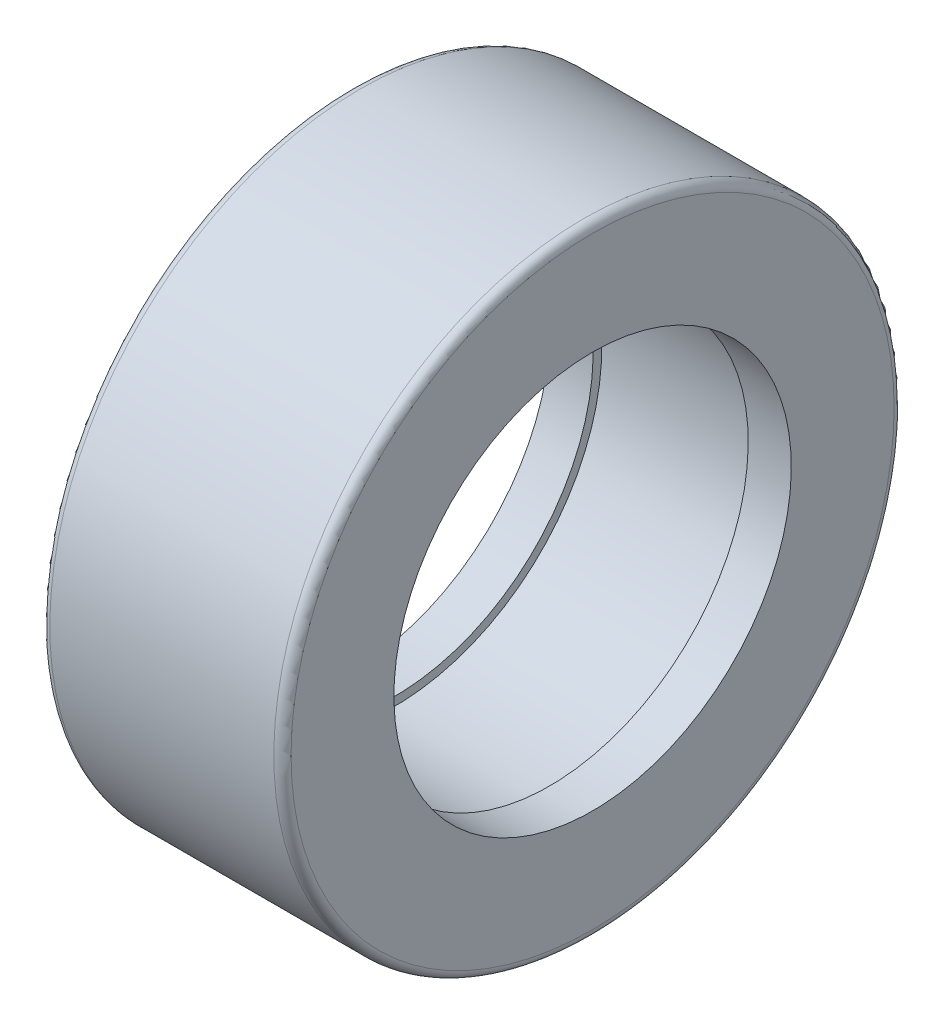
ISO-10303-21;
HEADER;
FILE_DESCRIPTION(('STEP AP214'),'2;1');
FILE_NAME('part.step','',(''),(''),'','','');
FILE_SCHEMA(('AUTOMOTIVE_DESIGN { 1 0 10303 214 1 1 1 1 }'));
ENDSEC;
DATA;
#1=APPLICATION_CONTEXT('core data for automotive mechanical design processes');
#2=APPLICATION_PROTOCOL_DEFINITION('international standard','automotive_design',2000,#1);
#3=PRODUCT_CONTEXT('',#1,'mechanical');
#4=PRODUCT('Part','Part','',(#3));
#5=PRODUCT_RELATED_PRODUCT_CATEGORY('part','',(#4));
#6=PRODUCT_DEFINITION_FORMATION('','',#4);
#7=PRODUCT_DEFINITION_CONTEXT('part definition',#1,'design');
#8=PRODUCT_DEFINITION('design','',#6,#7);
#9=PRODUCT_DEFINITION_SHAPE('','',#8);
#10=(LENGTH_UNIT() NAMED_UNIT(*) SI_UNIT(.MILLI.,.METRE.));
#11=(NAMED_UNIT(*) PLANE_ANGLE_UNIT() SI_UNIT($,.RADIAN.));
#12=(NAMED_UNIT(*) SI_UNIT($,.STERADIAN.) SOLID_ANGLE_UNIT());
#13=UNCERTAINTY_MEASURE_WITH_UNIT(LENGTH_MEASURE(1.E-05),#10,'distance_accuracy_value','');
#14=(GEOMETRIC_REPRESENTATION_CONTEXT(3) GLOBAL_UNCERTAINTY_ASSIGNED_CONTEXT((#13)) GLOBAL_UNIT_ASSIGNED_CONTEXT((#10,
#11,#12)) REPRESENTATION_CONTEXT('',''));
#15=CARTESIAN_POINT('',(0.,0.,0.));
#16=DIRECTION('',(0.,0.,1.));
#17=DIRECTION('',(1.,0.,0.));
#18=AXIS2_PLACEMENT_3D('',#15,#16,#17);
#19=CARTESIAN_POINT('',(2.5,0.,0.));
#20=DIRECTION('',(-1.,0.,0.));
#21=DIRECTION('',(0.,1.,0.));
#22=AXIS2_PLACEMENT_3D('',#19,#20,#21);
#23=CYLINDRICAL_SURFACE('',#22,23.065);
#24=CARTESIAN_POINT('',(5.,0.,0.));
#25=DIRECTION('',(1.,0.,0.));
#26=DIRECTION('',(0.,1.,0.));
#27=AXIS2_PLACEMENT_3D('',#24,#25,#26);
#28=CIRCLE('',#27,23.065);
#29=CARTESIAN_POINT('',(5.,23.065,0.));
#30=VERTEX_POINT('',#29);
#31=EDGE_CURVE('E11',#30,#30,#28,.T.);
#32=ORIENTED_EDGE('',*,*,#31,.T.);
#33=EDGE_LOOP('',(#32));
#34=FACE_BOUND('',#33,.T.);
#35=CARTESIAN_POINT('',(0.,0.,0.));
#36=DIRECTION('',(1.,0.,0.));
#37=DIRECTION('',(0.,1.,0.));
#38=AXIS2_PLACEMENT_3D('',#35,#36,#37);
#39=CIRCLE('',#38,23.065);
#40=CARTESIAN_POINT('',(0.,23.065,0.));
#41=VERTEX_POINT('',#40);
#42=EDGE_CURVE('E63',#41,#41,#39,.T.);
#43=ORIENTED_EDGE('',*,*,#42,.F.);
#44=EDGE_LOOP('',(#43));
#45=FACE_BOUND('',#44,.T.);
#46=ADVANCED_FACE('F17',(#34,#45),#23,.F.);
#47=CARTESIAN_POINT('',(5.,23.565,0.));
#48=DIRECTION('',(1.,0.,0.));
#49=DIRECTION('',(0.,1.,0.));
#50=AXIS2_PLACEMENT_3D('',#47,#48,#49);
#51=PLANE('',#50);
#52=CARTESIAN_POINT('',(5.,0.,0.));
#53=DIRECTION('',(1.,0.,0.));
#54=DIRECTION('',(0.,1.,0.));
#55=AXIS2_PLACEMENT_3D('',#52,#53,#54);
#56=CIRCLE('',#55,24.065);
#57=CARTESIAN_POINT('',(5.,24.065,0.));
#58=VERTEX_POINT('',#57);
#59=EDGE_CURVE('E26',#58,#58,#56,.T.);
#60=ORIENTED_EDGE('',*,*,#59,.T.);
#61=EDGE_LOOP('',(#60));
#62=FACE_BOUND('',#61,.T.);
#63=ORIENTED_EDGE('',*,*,#31,.F.);
#64=EDGE_LOOP('',(#63));
#65=FACE_BOUND('',#64,.T.);
#66=ADVANCED_FACE('F19',(#62,#65),#51,.T.);
#67=CARTESIAN_POINT('',(14.,0.,0.));
#68=DIRECTION('',(-1.,0.,0.));
#69=DIRECTION('',(0.,1.,0.));
#70=AXIS2_PLACEMENT_3D('',#67,#68,#69);
#71=CYLINDRICAL_SURFACE('',#70,24.065);
#72=CARTESIAN_POINT('',(23.,0.,0.));
#73=DIRECTION('',(1.,0.,0.));
#74=DIRECTION('',(0.,1.,0.));
#75=AXIS2_PLACEMENT_3D('',#72,#73,#74);
#76=CIRCLE('',#75,24.065);
#77=CARTESIAN_POINT('',(23.,24.065,0.));
#78=VERTEX_POINT('',#77);
#79=EDGE_CURVE('E69',#78,#78,#76,.T.);
#80=ORIENTED_EDGE('',*,*,#79,.T.);
#81=EDGE_LOOP('',(#80));
#82=FACE_BOUND('',#81,.T.);
#83=ORIENTED_EDGE('',*,*,#59,.F.);
#84=EDGE_LOOP('',(#83));
#85=FACE_BOUND('',#84,.T.);
#86=ADVANCED_FACE('F103',(#82,#85),#71,.F.);
#87=CARTESIAN_POINT('',(23.,23.565,0.));
#88=DIRECTION('',(-1.,0.,0.));
#89=DIRECTION('',(0.,-1.,0.));
#90=AXIS2_PLACEMENT_3D('',#87,#88,#89);
#91=PLANE('',#90);
#92=CARTESIAN_POINT('',(23.,0.,0.));
#93=DIRECTION('',(1.,0.,0.));
#94=DIRECTION('',(0.,1.,0.));
#95=AXIS2_PLACEMENT_3D('',#92,#93,#94);
#96=CIRCLE('',#95,23.065);
#97=CARTESIAN_POINT('',(23.,23.065,0.));
#98=VERTEX_POINT('',#97);
#99=EDGE_CURVE('E73',#98,#98,#96,.T.);
#100=ORIENTED_EDGE('',*,*,#99,.T.);
#101=EDGE_LOOP('',(#100));
#102=FACE_BOUND('',#101,.T.);
#103=ORIENTED_EDGE('',*,*,#79,.F.);
#104=EDGE_LOOP('',(#103));
#105=FACE_BOUND('',#104,.T.);
#106=ADVANCED_FACE('F95',(#102,#105),#91,.T.);
#107=CARTESIAN_POINT('',(25.5,0.,0.));
#108=DIRECTION('',(-1.,0.,0.));
#109=DIRECTION('',(0.,1.,0.));
#110=AXIS2_PLACEMENT_3D('',#107,#108,#109);
#111=CYLINDRICAL_SURFACE('',#110,23.065);
#112=CARTESIAN_POINT('',(28.,0.,0.));
#113=DIRECTION('',(1.,0.,0.));
#114=DIRECTION('',(0.,1.,0.));
#115=AXIS2_PLACEMENT_3D('',#112,#113,#114);
#116=CIRCLE('',#115,23.065);
#117=CARTESIAN_POINT('',(28.,23.065,0.));
#118=VERTEX_POINT('',#117);
#119=EDGE_CURVE('E77',#118,#118,#116,.T.);
#120=ORIENTED_EDGE('',*,*,#119,.T.);
#121=EDGE_LOOP('',(#120));
#122=FACE_BOUND('',#121,.T.);
#123=ORIENTED_EDGE('',*,*,#99,.F.);
#124=EDGE_LOOP('',(#123));
#125=FACE_BOUND('',#124,.T.);
#126=ADVANCED_FACE('F83',(#122,#125),#111,.F.);
#127=CARTESIAN_POINT('',(28.,29.0325,0.));
#128=DIRECTION('',(1.,0.,0.));
#129=DIRECTION('',(0.,1.,0.));
#130=AXIS2_PLACEMENT_3D('',#127,#128,#129);
#131=PLANE('',#130);
#132=CARTESIAN_POINT('',(28.,0.,0.));
#133=DIRECTION('',(1.,0.,0.));
#134=DIRECTION('',(0.,1.,0.));
#135=AXIS2_PLACEMENT_3D('',#132,#133,#134);
#136=CIRCLE('',#135,35.);
#137=CARTESIAN_POINT('',(28.,35.,0.));
#138=VERTEX_POINT('',#137);
#139=EDGE_CURVE('E49',#138,#138,#136,.T.);
#140=ORIENTED_EDGE('',*,*,#139,.T.);
#141=EDGE_LOOP('',(#140));
#142=FACE_BOUND('',#141,.T.);
#143=ORIENTED_EDGE('',*,*,#119,.F.);
#144=EDGE_LOOP('',(#143));
#145=FACE_BOUND('',#144,.T.);
#146=ADVANCED_FACE('F86',(#142,#145),#131,.T.);
#147=CARTESIAN_POINT('',(27.,0.,0.));
#148=DIRECTION('',(1.,0.,0.));
#149=DIRECTION('',(0.,0.,-1.));
#150=AXIS2_PLACEMENT_3D('',#147,#148,#149);
#151=TOROIDAL_SURFACE('',#150,35.,1.);
#152=CARTESIAN_POINT('',(27.,0.,0.));
#153=DIRECTION('',(1.,0.,0.));
#154=DIRECTION('',(0.,1.,0.));
#155=AXIS2_PLACEMENT_3D('',#152,#153,#154);
#156=CIRCLE('',#155,36.);
#157=CARTESIAN_POINT('',(27.,36.,0.));
#158=VERTEX_POINT('',#157);
#159=EDGE_CURVE('E55',#158,#158,#156,.T.);
#160=ORIENTED_EDGE('',*,*,#159,.T.);
#161=EDGE_LOOP('',(#160));
#162=FACE_BOUND('',#161,.T.);
#163=ORIENTED_EDGE('',*,*,#139,.F.);
#164=EDGE_LOOP('',(#163));
#165=FACE_BOUND('',#164,.T.);
#166=ADVANCED_FACE('F88',(#162,#165),#151,.T.);
#167=CARTESIAN_POINT('',(14.,0.,0.));
#168=DIRECTION('',(-1.,0.,0.));
#169=DIRECTION('',(0.,1.,0.));
#170=AXIS2_PLACEMENT_3D('',#167,#168,#169);
#171=CYLINDRICAL_SURFACE('',#170,36.);
#172=CARTESIAN_POINT('',(1.,0.,0.));
#173=DIRECTION('',(1.,0.,0.));
#174=DIRECTION('',(0.,1.,0.));
#175=AXIS2_PLACEMENT_3D('',#172,#173,#174);
#176=CIRCLE('',#175,36.);
#177=CARTESIAN_POINT('',(1.,36.,0.));
#178=VERTEX_POINT('',#177);
#179=EDGE_CURVE('E59',#178,#178,#176,.T.);
#180=ORIENTED_EDGE('',*,*,#179,.T.);
#181=EDGE_LOOP('',(#180));
#182=FACE_BOUND('',#181,.T.);
#183=ORIENTED_EDGE('',*,*,#159,.F.);
#184=EDGE_LOOP('',(#183));
#185=FACE_BOUND('',#184,.T.);
#186=ADVANCED_FACE('F60',(#182,#185),#171,.T.);
#187=CARTESIAN_POINT('',(1.,0.,0.));
#188=DIRECTION('',(1.,0.,0.));
#189=DIRECTION('',(0.,0.,-1.));
#190=AXIS2_PLACEMENT_3D('',#187,#188,#189);
#191=TOROIDAL_SURFACE('',#190,35.,1.);
#192=CARTESIAN_POINT('',(0.,0.,0.));
#193=DIRECTION('',(1.,0.,0.));
#194=DIRECTION('',(0.,1.,0.));
#195=AXIS2_PLACEMENT_3D('',#192,#193,#194);
#196=CIRCLE('',#195,35.);
#197=CARTESIAN_POINT('',(0.,35.,0.));
#198=VERTEX_POINT('',#197);
#199=EDGE_CURVE('E66',#198,#198,#196,.T.);
#200=ORIENTED_EDGE('',*,*,#199,.T.);
#201=EDGE_LOOP('',(#200));
#202=FACE_BOUND('',#201,.T.);
#203=ORIENTED_EDGE('',*,*,#179,.F.);
#204=EDGE_LOOP('',(#203));
#205=FACE_BOUND('',#204,.T.);
#206=ADVANCED_FACE('F108',(#202,#205),#191,.T.);
#207=CARTESIAN_POINT('',(0.,29.0325,0.));
#208=DIRECTION('',(-1.,0.,0.));
#209=DIRECTION('',(0.,-1.,0.));
#210=AXIS2_PLACEMENT_3D('',#207,#208,#209);
#211=PLANE('',#210);
#212=ORIENTED_EDGE('',*,*,#42,.T.);
#213=EDGE_LOOP('',(#212));
#214=FACE_BOUND('',#213,.T.);
#215=ORIENTED_EDGE('',*,*,#199,.F.);
#216=EDGE_LOOP('',(#215));
#217=FACE_BOUND('',#216,.T.);
#218=ADVANCED_FACE('F110',(#214,#217),#211,.T.);
#219=CLOSED_SHELL('',(#46,#66,#86,#106,#126,#146,#166,#186,#206,#218));
#220=MANIFOLD_SOLID_BREP('B1',#219);
#221=ADVANCED_BREP_SHAPE_REPRESENTATION('',(#18,#220),#14);
#222=SHAPE_DEFINITION_REPRESENTATION(#9,#221);
ENDSEC;
END-ISO-10303-21;
